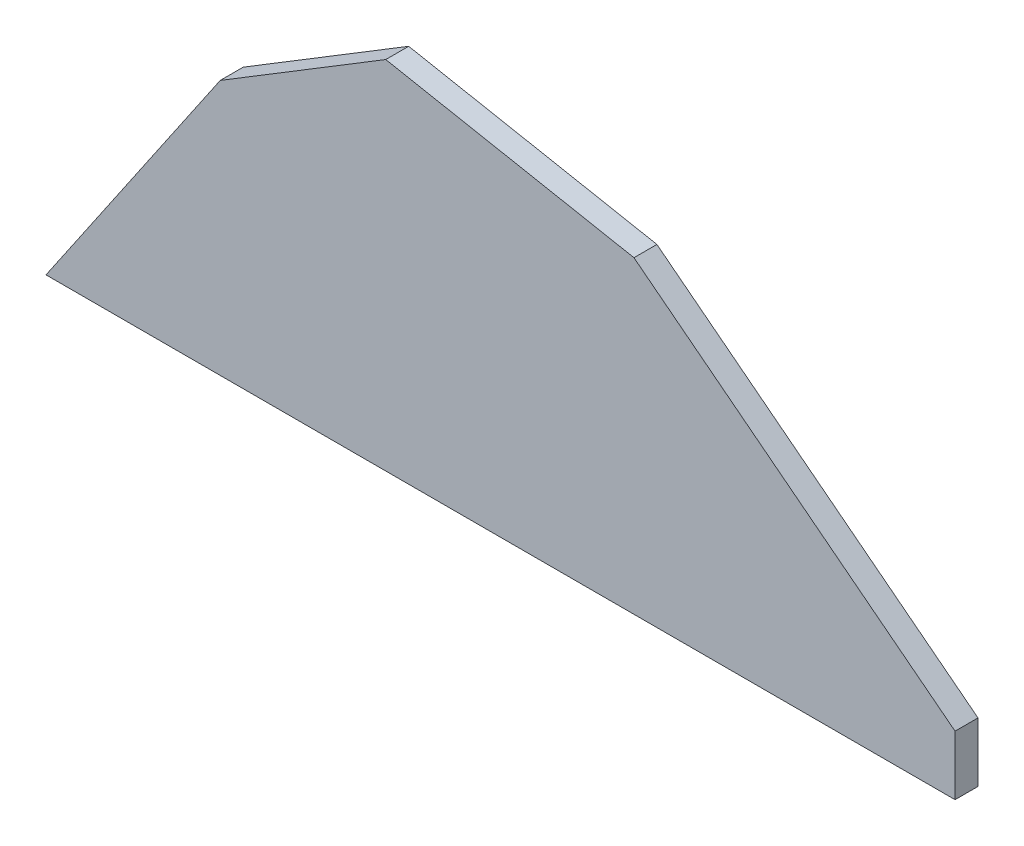
ISO-10303-21;
HEADER;
FILE_DESCRIPTION(('STEP AP214'),'2;1');
FILE_NAME('part.step','',(''),(''),'','','');
FILE_SCHEMA(('AUTOMOTIVE_DESIGN { 1 0 10303 214 1 1 1 1 }'));
ENDSEC;
DATA;
#1=APPLICATION_CONTEXT('core data for automotive mechanical design processes');
#2=APPLICATION_PROTOCOL_DEFINITION('international standard','automotive_design',2000,#1);
#3=PRODUCT_CONTEXT('',#1,'mechanical');
#4=PRODUCT('Part','Part','',(#3));
#5=PRODUCT_RELATED_PRODUCT_CATEGORY('part','',(#4));
#6=PRODUCT_DEFINITION_FORMATION('','',#4);
#7=PRODUCT_DEFINITION_CONTEXT('part definition',#1,'design');
#8=PRODUCT_DEFINITION('design','',#6,#7);
#9=PRODUCT_DEFINITION_SHAPE('','',#8);
#10=(LENGTH_UNIT() NAMED_UNIT(*) SI_UNIT(.MILLI.,.METRE.));
#11=(NAMED_UNIT(*) PLANE_ANGLE_UNIT() SI_UNIT($,.RADIAN.));
#12=(NAMED_UNIT(*) SI_UNIT($,.STERADIAN.) SOLID_ANGLE_UNIT());
#13=UNCERTAINTY_MEASURE_WITH_UNIT(LENGTH_MEASURE(1.E-05),#10,'distance_accuracy_value','');
#14=(GEOMETRIC_REPRESENTATION_CONTEXT(3) GLOBAL_UNCERTAINTY_ASSIGNED_CONTEXT((#13)) GLOBAL_UNIT_ASSIGNED_CONTEXT((#10,
#11,#12)) REPRESENTATION_CONTEXT('',''));
#15=CARTESIAN_POINT('',(0.,0.,0.));
#16=DIRECTION('',(0.,0.,1.));
#17=DIRECTION('',(1.,0.,0.));
#18=AXIS2_PLACEMENT_3D('',#15,#16,#17);
#19=CARTESIAN_POINT('',(-61.087,19.2524994131455,2.5));
#20=DIRECTION('',(0.826207411041324,-0.563366056787585,0.));
#21=DIRECTION('',(0.563366056787585,0.826207411041324,0.));
#22=AXIS2_PLACEMENT_3D('',#19,#20,#21);
#23=PLANE('',#22);
#24=DIRECTION('',(-0.563366056787585,-0.826207411041324,0.));
#25=VECTOR('',#24,1.);
#26=CARTESIAN_POINT('',(-61.087,19.2524994131455,-2.5));
#27=LINE('',#26,#25);
#28=CARTESIAN_POINT('',(-61.087,19.2524994131455,-2.5));
#29=VERTEX_POINT('',#28);
#30=CARTESIAN_POINT('',(-99.06,-36.4370005868545,-2.5));
#31=VERTEX_POINT('',#30);
#32=EDGE_CURVE('E119',#29,#31,#27,.T.);
#33=ORIENTED_EDGE('',*,*,#32,.T.);
#34=DIRECTION('',(0.,0.,-1.));
#35=VECTOR('',#34,1.);
#36=CARTESIAN_POINT('',(-99.06,-36.4370005868545,2.5));
#37=LINE('',#36,#35);
#38=CARTESIAN_POINT('',(-99.06,-36.4370005868545,2.5));
#39=VERTEX_POINT('',#38);
#40=EDGE_CURVE('E11',#39,#31,#37,.T.);
#41=ORIENTED_EDGE('',*,*,#40,.F.);
#42=DIRECTION('',(-0.563366056787585,-0.826207411041324,0.));
#43=VECTOR('',#42,1.);
#44=CARTESIAN_POINT('',(-61.087,19.2524994131455,2.5));
#45=LINE('',#44,#43);
#46=CARTESIAN_POINT('',(-61.087,19.2524994131455,2.5));
#47=VERTEX_POINT('',#46);
#48=EDGE_CURVE('E129',#47,#39,#45,.T.);
#49=ORIENTED_EDGE('',*,*,#48,.F.);
#50=DIRECTION('',(0.,0.,-1.));
#51=VECTOR('',#50,1.);
#52=CARTESIAN_POINT('',(-61.087,19.2524994131455,2.5));
#53=LINE('',#52,#51);
#54=EDGE_CURVE('E115',#47,#29,#53,.T.);
#55=ORIENTED_EDGE('',*,*,#54,.T.);
#56=EDGE_LOOP('',(#33,#41,#49,#55));
#57=FACE_BOUND('',#56,.T.);
#58=ADVANCED_FACE('F35',(#57),#23,.F.);
#59=CARTESIAN_POINT('',(-99.06,-36.4370005868545,2.5));
#60=DIRECTION('',(0.,1.,0.));
#61=DIRECTION('',(-1.,0.,0.));
#62=AXIS2_PLACEMENT_3D('',#59,#60,#61);
#63=PLANE('',#62);
#64=DIRECTION('',(1.,0.,0.));
#65=VECTOR('',#64,1.);
#66=CARTESIAN_POINT('',(-99.06,-36.4370005868545,-2.5));
#67=LINE('',#66,#65);
#68=CARTESIAN_POINT('',(99.06,-36.4370005868545,-2.5));
#69=VERTEX_POINT('',#68);
#70=EDGE_CURVE('E122',#31,#69,#67,.T.);
#71=ORIENTED_EDGE('',*,*,#70,.T.);
#72=DIRECTION('',(0.,0.,-1.));
#73=VECTOR('',#72,1.);
#74=CARTESIAN_POINT('',(99.06,-36.4370005868545,2.5));
#75=LINE('',#74,#73);
#76=CARTESIAN_POINT('',(99.06,-36.4370005868545,2.5));
#77=VERTEX_POINT('',#76);
#78=EDGE_CURVE('E43',#77,#69,#75,.T.);
#79=ORIENTED_EDGE('',*,*,#78,.F.);
#80=DIRECTION('',(1.,0.,0.));
#81=VECTOR('',#80,1.);
#82=CARTESIAN_POINT('',(-99.06,-36.4370005868545,2.5));
#83=LINE('',#82,#81);
#84=EDGE_CURVE('E88',#39,#77,#83,.T.);
#85=ORIENTED_EDGE('',*,*,#84,.F.);
#86=ORIENTED_EDGE('',*,*,#40,.T.);
#87=EDGE_LOOP('',(#71,#79,#85,#86));
#88=FACE_BOUND('',#87,.T.);
#89=ADVANCED_FACE('F153',(#88),#63,.F.);
#90=CARTESIAN_POINT('',(99.06,-36.4370005868545,2.5));
#91=DIRECTION('',(-1.,0.,0.));
#92=DIRECTION('',(0.,0.,1.));
#93=AXIS2_PLACEMENT_3D('',#90,#91,#92);
#94=PLANE('',#93);
#95=DIRECTION('',(0.,1.,0.));
#96=VECTOR('',#95,1.);
#97=CARTESIAN_POINT('',(99.06,-36.4370005868545,-2.5));
#98=LINE('',#97,#96);
#99=CARTESIAN_POINT('',(99.06,-23.4957005868545,-2.5));
#100=VERTEX_POINT('',#99);
#101=EDGE_CURVE('E124',#69,#100,#98,.T.);
#102=ORIENTED_EDGE('',*,*,#101,.T.);
#103=DIRECTION('',(0.,0.,-1.));
#104=VECTOR('',#103,1.);
#105=CARTESIAN_POINT('',(99.06,-23.4957005868545,2.5));
#106=LINE('',#105,#104);
#107=CARTESIAN_POINT('',(99.06,-23.4957005868545,2.5));
#108=VERTEX_POINT('',#107);
#109=EDGE_CURVE('E110',#108,#100,#106,.T.);
#110=ORIENTED_EDGE('',*,*,#109,.F.);
#111=DIRECTION('',(0.,1.,0.));
#112=VECTOR('',#111,1.);
#113=CARTESIAN_POINT('',(99.06,-36.4370005868545,2.5));
#114=LINE('',#113,#112);
#115=EDGE_CURVE('E101',#77,#108,#114,.T.);
#116=ORIENTED_EDGE('',*,*,#115,.F.);
#117=ORIENTED_EDGE('',*,*,#78,.T.);
#118=EDGE_LOOP('',(#102,#110,#116,#117));
#119=FACE_BOUND('',#118,.T.);
#120=ADVANCED_FACE('F135',(#119),#94,.F.);
#121=CARTESIAN_POINT('',(99.06,-23.4957005868545,2.5));
#122=DIRECTION('',(-0.613533736398589,-0.789668509123155,0.));
#123=DIRECTION('',(0.789668509123155,-0.613533736398589,0.));
#124=AXIS2_PLACEMENT_3D('',#121,#122,#123);
#125=PLANE('',#124);
#126=DIRECTION('',(-0.789668509123155,0.613533736398589,0.));
#127=VECTOR('',#126,1.);
#128=CARTESIAN_POINT('',(99.06,-23.4957005868545,-2.5));
#129=LINE('',#128,#127);
#130=CARTESIAN_POINT('',(29.083,30.8729994131455,-2.5));
#131=VERTEX_POINT('',#130);
#132=EDGE_CURVE('E109',#100,#131,#129,.T.);
#133=ORIENTED_EDGE('',*,*,#132,.T.);
#134=DIRECTION('',(0.,0.,-1.));
#135=VECTOR('',#134,1.);
#136=CARTESIAN_POINT('',(29.083,30.8729994131455,2.5));
#137=LINE('',#136,#135);
#138=CARTESIAN_POINT('',(29.083,30.8729994131455,2.5));
#139=VERTEX_POINT('',#138);
#140=EDGE_CURVE('E106',#139,#131,#137,.T.);
#141=ORIENTED_EDGE('',*,*,#140,.F.);
#142=DIRECTION('',(-0.789668509123155,0.613533736398589,0.));
#143=VECTOR('',#142,1.);
#144=CARTESIAN_POINT('',(99.06,-23.4957005868545,2.5));
#145=LINE('',#144,#143);
#146=EDGE_CURVE('E95',#108,#139,#145,.T.);
#147=ORIENTED_EDGE('',*,*,#146,.F.);
#148=ORIENTED_EDGE('',*,*,#109,.T.);
#149=EDGE_LOOP('',(#133,#141,#147,#148));
#150=FACE_BOUND('',#149,.T.);
#151=ADVANCED_FACE('F107',(#150),#125,.F.);
#152=CARTESIAN_POINT('',(29.083,30.8729994131455,2.5));
#153=DIRECTION('',(-0.187906647284529,-0.982186892554715,0.));
#154=DIRECTION('',(0.982186892554715,-0.187906647284529,0.));
#155=AXIS2_PLACEMENT_3D('',#152,#153,#154);
#156=PLANE('',#155);
#157=DIRECTION('',(-0.982186892554715,0.187906647284529,0.));
#158=VECTOR('',#157,1.);
#159=CARTESIAN_POINT('',(29.083,30.8729994131455,-2.5));
#160=LINE('',#159,#158);
#161=CARTESIAN_POINT('',(-25.019,41.2234994131455,-2.5));
#162=VERTEX_POINT('',#161);
#163=EDGE_CURVE('E74',#131,#162,#160,.T.);
#164=ORIENTED_EDGE('',*,*,#163,.T.);
#165=DIRECTION('',(0.,0.,-1.));
#166=VECTOR('',#165,1.);
#167=CARTESIAN_POINT('',(-25.019,41.2234994131455,2.5));
#168=LINE('',#167,#166);
#169=CARTESIAN_POINT('',(-25.019,41.2234994131455,2.5));
#170=VERTEX_POINT('',#169);
#171=EDGE_CURVE('E111',#170,#162,#168,.T.);
#172=ORIENTED_EDGE('',*,*,#171,.F.);
#173=DIRECTION('',(-0.982186892554715,0.187906647284529,0.));
#174=VECTOR('',#173,1.);
#175=CARTESIAN_POINT('',(29.083,30.8729994131455,2.5));
#176=LINE('',#175,#174);
#177=EDGE_CURVE('E99',#139,#170,#176,.T.);
#178=ORIENTED_EDGE('',*,*,#177,.F.);
#179=ORIENTED_EDGE('',*,*,#140,.T.);
#180=EDGE_LOOP('',(#164,#172,#178,#179));
#181=FACE_BOUND('',#180,.T.);
#182=ADVANCED_FACE('F113',(#181),#156,.F.);
#183=CARTESIAN_POINT('',(-25.019,41.2234994131455,2.5));
#184=DIRECTION('',(0.520233113325719,-0.854024301644532,0.));
#185=DIRECTION('',(0.854024301644532,0.520233113325719,0.));
#186=AXIS2_PLACEMENT_3D('',#183,#184,#185);
#187=PLANE('',#186);
#188=DIRECTION('',(-0.854024301644532,-0.520233113325719,0.));
#189=VECTOR('',#188,1.);
#190=CARTESIAN_POINT('',(-25.019,41.2234994131455,-2.5));
#191=LINE('',#190,#189);
#192=EDGE_CURVE('E80',#162,#29,#191,.T.);
#193=ORIENTED_EDGE('',*,*,#192,.T.);
#194=ORIENTED_EDGE('',*,*,#54,.F.);
#195=DIRECTION('',(-0.854024301644532,-0.520233113325719,0.));
#196=VECTOR('',#195,1.);
#197=CARTESIAN_POINT('',(-25.019,41.2234994131455,2.5));
#198=LINE('',#197,#196);
#199=EDGE_CURVE('E51',#170,#47,#198,.T.);
#200=ORIENTED_EDGE('',*,*,#199,.F.);
#201=ORIENTED_EDGE('',*,*,#171,.T.);
#202=EDGE_LOOP('',(#193,#194,#200,#201));
#203=FACE_BOUND('',#202,.T.);
#204=ADVANCED_FACE('F142',(#203),#187,.F.);
#205=CARTESIAN_POINT('',(0.,0.,2.5));
#206=DIRECTION('',(0.,0.,-1.));
#207=DIRECTION('',(-1.,0.,0.));
#208=AXIS2_PLACEMENT_3D('',#205,#206,#207);
#209=PLANE('',#208);
#210=ORIENTED_EDGE('',*,*,#48,.T.);
#211=ORIENTED_EDGE('',*,*,#84,.T.);
#212=ORIENTED_EDGE('',*,*,#115,.T.);
#213=ORIENTED_EDGE('',*,*,#146,.T.);
#214=ORIENTED_EDGE('',*,*,#177,.T.);
#215=ORIENTED_EDGE('',*,*,#199,.T.);
#216=EDGE_LOOP('',(#210,#211,#212,#213,#214,#215));
#217=FACE_BOUND('',#216,.T.);
#218=ADVANCED_FACE('F97',(#217),#209,.F.);
#219=CARTESIAN_POINT('',(0.,0.,-2.5));
#220=DIRECTION('',(0.,0.,-1.));
#221=DIRECTION('',(-1.,0.,0.));
#222=AXIS2_PLACEMENT_3D('',#219,#220,#221);
#223=PLANE('',#222);
#224=ORIENTED_EDGE('',*,*,#32,.F.);
#225=ORIENTED_EDGE('',*,*,#192,.F.);
#226=ORIENTED_EDGE('',*,*,#163,.F.);
#227=ORIENTED_EDGE('',*,*,#132,.F.);
#228=ORIENTED_EDGE('',*,*,#101,.F.);
#229=ORIENTED_EDGE('',*,*,#70,.F.);
#230=EDGE_LOOP('',(#224,#225,#226,#227,#228,#229));
#231=FACE_BOUND('',#230,.T.);
#232=ADVANCED_FACE('F138',(#231),#223,.T.);
#233=CLOSED_SHELL('',(#58,#89,#120,#151,#182,#204,#218,#232));
#234=MANIFOLD_SOLID_BREP('B2',#233);
#235=ADVANCED_BREP_SHAPE_REPRESENTATION('',(#18,#234),#14);
#236=SHAPE_DEFINITION_REPRESENTATION(#9,#235);
ENDSEC;
END-ISO-10303-21;
